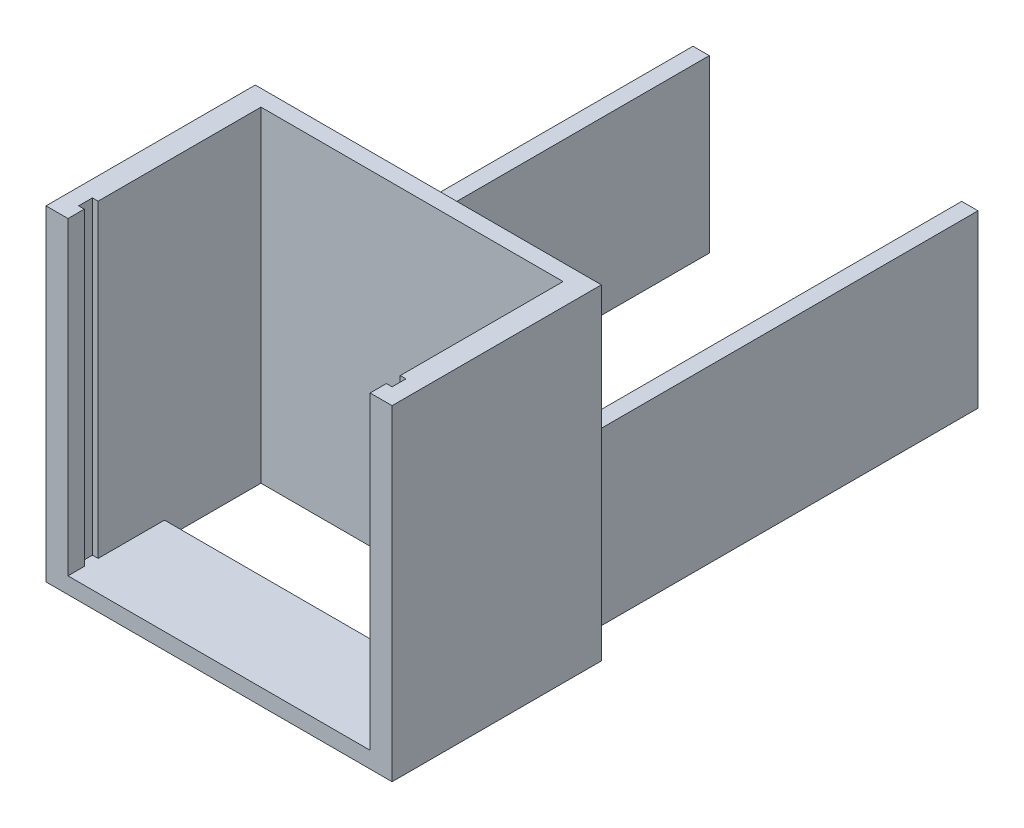
ISO-10303-21;
HEADER;
FILE_DESCRIPTION(('STEP AP214'),'2;1');
FILE_NAME('part.step','',(''),(''),'','','');
FILE_SCHEMA(('AUTOMOTIVE_DESIGN { 1 0 10303 214 1 1 1 1 }'));
ENDSEC;
DATA;
#1=APPLICATION_CONTEXT('core data for automotive mechanical design processes');
#2=APPLICATION_PROTOCOL_DEFINITION('international standard','automotive_design',2000,#1);
#3=PRODUCT_CONTEXT('',#1,'mechanical');
#4=PRODUCT('Part','Part','',(#3));
#5=PRODUCT_RELATED_PRODUCT_CATEGORY('part','',(#4));
#6=PRODUCT_DEFINITION_FORMATION('','',#4);
#7=PRODUCT_DEFINITION_CONTEXT('part definition',#1,'design');
#8=PRODUCT_DEFINITION('design','',#6,#7);
#9=PRODUCT_DEFINITION_SHAPE('','',#8);
#10=(LENGTH_UNIT() NAMED_UNIT(*) SI_UNIT(.MILLI.,.METRE.));
#11=(NAMED_UNIT(*) PLANE_ANGLE_UNIT() SI_UNIT($,.RADIAN.));
#12=(NAMED_UNIT(*) SI_UNIT($,.STERADIAN.) SOLID_ANGLE_UNIT());
#13=UNCERTAINTY_MEASURE_WITH_UNIT(LENGTH_MEASURE(1.E-05),#10,'distance_accuracy_value','');
#14=(GEOMETRIC_REPRESENTATION_CONTEXT(3) GLOBAL_UNCERTAINTY_ASSIGNED_CONTEXT((#13)) GLOBAL_UNIT_ASSIGNED_CONTEXT((#10,
#11,#12)) REPRESENTATION_CONTEXT('',''));
#15=CARTESIAN_POINT('',(0.,0.,0.));
#16=DIRECTION('',(0.,0.,1.));
#17=DIRECTION('',(1.,0.,0.));
#18=AXIS2_PLACEMENT_3D('',#15,#16,#17);
#19=CARTESIAN_POINT('',(0.,0.,2.39346473029046));
#20=DIRECTION('',(0.,0.,-1.));
#21=DIRECTION('',(-1.,0.,0.));
#22=AXIS2_PLACEMENT_3D('',#19,#20,#21);
#23=PLANE('',#22);
#24=DIRECTION('',(0.,-1.,0.));
#25=VECTOR('',#24,1.);
#26=CARTESIAN_POINT('',(-61.1489834024897,0.,2.39346473029046));
#27=LINE('',#26,#25);
#28=CARTESIAN_POINT('',(-61.1489834024897,19.,2.39346473029046));
#29=VERTEX_POINT('',#28);
#30=CARTESIAN_POINT('',(-61.1489834024897,-2.,2.39346473029046));
#31=VERTEX_POINT('',#30);
#32=EDGE_CURVE('E214',#29,#31,#27,.T.);
#33=ORIENTED_EDGE('',*,*,#32,.T.);
#34=DIRECTION('',(-1.,0.,0.));
#35=VECTOR('',#34,1.);
#36=CARTESIAN_POINT('',(-22.3989834024897,-2.,2.39346473029046));
#37=LINE('',#36,#35);
#38=CARTESIAN_POINT('',(-64.8989834024897,-2.,2.39346473029046));
#39=VERTEX_POINT('',#38);
#40=EDGE_CURVE('E294',#31,#39,#37,.T.);
#41=ORIENTED_EDGE('',*,*,#40,.T.);
#42=DIRECTION('',(0.,1.,0.));
#43=VECTOR('',#42,1.);
#44=CARTESIAN_POINT('',(-64.8989834024897,38.,2.39346473029046));
#45=LINE('',#44,#43);
#46=CARTESIAN_POINT('',(-64.8989834024897,38.,2.39346473029046));
#47=VERTEX_POINT('',#46);
#48=EDGE_CURVE('E298',#39,#47,#45,.T.);
#49=ORIENTED_EDGE('',*,*,#48,.T.);
#50=DIRECTION('',(1.,0.,0.));
#51=VECTOR('',#50,1.);
#52=CARTESIAN_POINT('',(-22.3989834024897,38.,2.39346473029046));
#53=LINE('',#52,#51);
#54=CARTESIAN_POINT('',(-22.3989834024897,38.,2.39346473029046));
#55=VERTEX_POINT('',#54);
#56=EDGE_CURVE('E302',#47,#55,#53,.T.);
#57=ORIENTED_EDGE('',*,*,#56,.T.);
#58=DIRECTION('',(0.,-1.,0.));
#59=VECTOR('',#58,1.);
#60=CARTESIAN_POINT('',(-22.3989834024897,38.,2.39346473029046));
#61=LINE('',#60,#59);
#62=CARTESIAN_POINT('',(-22.3989834024897,-2.,2.39346473029046));
#63=VERTEX_POINT('',#62);
#64=EDGE_CURVE('E291',#55,#63,#61,.T.);
#65=ORIENTED_EDGE('',*,*,#64,.T.);
#66=CARTESIAN_POINT('',(-26.1489834024897,-2.,2.39346473029046));
#67=VERTEX_POINT('',#66);
#68=EDGE_CURVE('E295',#63,#67,#37,.T.);
#69=ORIENTED_EDGE('',*,*,#68,.T.);
#70=DIRECTION('',(0.,-1.,0.));
#71=VECTOR('',#70,1.);
#72=CARTESIAN_POINT('',(-26.1489834024897,0.,2.39346473029046));
#73=LINE('',#72,#71);
#74=CARTESIAN_POINT('',(-26.1489834024897,19.,2.39346473029046));
#75=VERTEX_POINT('',#74);
#76=EDGE_CURVE('E248',#75,#67,#73,.T.);
#77=ORIENTED_EDGE('',*,*,#76,.F.);
#78=DIRECTION('',(-1.,0.,0.));
#79=VECTOR('',#78,1.);
#80=CARTESIAN_POINT('',(0.,19.,2.39346473029046));
#81=LINE('',#80,#79);
#82=CARTESIAN_POINT('',(-28.1489834024897,19.,2.39346473029046));
#83=VERTEX_POINT('',#82);
#84=EDGE_CURVE('E258',#75,#83,#81,.T.);
#85=ORIENTED_EDGE('',*,*,#84,.T.);
#86=DIRECTION('',(0.,-1.,0.));
#87=VECTOR('',#86,1.);
#88=CARTESIAN_POINT('',(-28.1489834024897,0.,2.39346473029046));
#89=LINE('',#88,#87);
#90=CARTESIAN_POINT('',(-28.1489834024897,-2.,2.39346473029046));
#91=VERTEX_POINT('',#90);
#92=EDGE_CURVE('E217',#83,#91,#89,.T.);
#93=ORIENTED_EDGE('',*,*,#92,.T.);
#94=CARTESIAN_POINT('',(-59.1489834024897,-2.,2.39346473029046));
#95=VERTEX_POINT('',#94);
#96=EDGE_CURVE('E299',#91,#95,#37,.T.);
#97=ORIENTED_EDGE('',*,*,#96,.T.);
#98=DIRECTION('',(0.,-1.,0.));
#99=VECTOR('',#98,1.);
#100=CARTESIAN_POINT('',(-59.1489834024897,0.,2.39346473029046));
#101=LINE('',#100,#99);
#102=CARTESIAN_POINT('',(-59.1489834024897,19.,2.39346473029046));
#103=VERTEX_POINT('',#102);
#104=EDGE_CURVE('E57',#103,#95,#101,.T.);
#105=ORIENTED_EDGE('',*,*,#104,.F.);
#106=DIRECTION('',(-1.,0.,0.));
#107=VECTOR('',#106,1.);
#108=CARTESIAN_POINT('',(0.,18.9999999999999,2.39346473029046));
#109=LINE('',#108,#107);
#110=EDGE_CURVE('E52',#103,#29,#109,.T.);
#111=ORIENTED_EDGE('',*,*,#110,.T.);
#112=EDGE_LOOP('',(#33,#41,#49,#57,#65,#69,#77,#85,#93,#97,#105,#111));
#113=FACE_BOUND('',#112,.T.);
#114=ADVANCED_FACE('F37',(#113),#23,.T.);
#115=CARTESIAN_POINT('',(0.,0.,0.));
#116=DIRECTION('',(0.,-1.,0.));
#117=DIRECTION('',(0.,0.,-1.));
#118=AXIS2_PLACEMENT_3D('',#115,#116,#117);
#119=PLANE('',#118);
#120=DIRECTION('',(0.,0.,1.));
#121=VECTOR('',#120,1.);
#122=CARTESIAN_POINT('',(-25.0989834024897,0.,0.));
#123=LINE('',#122,#121);
#124=CARTESIAN_POINT('',(-25.0989834024897,0.,16.2434647302905));
#125=VERTEX_POINT('',#124);
#126=CARTESIAN_POINT('',(-25.0989834024897,0.,24.3934647302905));
#127=VERTEX_POINT('',#126);
#128=EDGE_CURVE('E312',#125,#127,#123,.T.);
#129=ORIENTED_EDGE('',*,*,#128,.F.);
#130=DIRECTION('',(1.,0.,0.));
#131=VECTOR('',#130,1.);
#132=CARTESIAN_POINT('',(0.,0.,16.2434647302905));
#133=LINE('',#132,#131);
#134=CARTESIAN_POINT('',(-62.1989834024897,0.,16.2434647302905));
#135=VERTEX_POINT('',#134);
#136=EDGE_CURVE('E271',#135,#125,#133,.T.);
#137=ORIENTED_EDGE('',*,*,#136,.F.);
#138=DIRECTION('',(0.,0.,1.));
#139=VECTOR('',#138,1.);
#140=CARTESIAN_POINT('',(-62.1989834024897,0.,0.));
#141=LINE('',#140,#139);
#142=CARTESIAN_POINT('',(-62.1989834024897,0.,24.3934647302905));
#143=VERTEX_POINT('',#142);
#144=EDGE_CURVE('E371',#135,#143,#141,.T.);
#145=ORIENTED_EDGE('',*,*,#144,.T.);
#146=DIRECTION('',(1.,0.,0.));
#147=VECTOR('',#146,1.);
#148=CARTESIAN_POINT('',(0.,0.,24.3934647302905));
#149=LINE('',#148,#147);
#150=CARTESIAN_POINT('',(-62.8989834024897,0.,24.3934647302905));
#151=VERTEX_POINT('',#150);
#152=EDGE_CURVE('E393',#151,#143,#149,.T.);
#153=ORIENTED_EDGE('',*,*,#152,.F.);
#154=DIRECTION('',(0.,0.,1.));
#155=VECTOR('',#154,1.);
#156=CARTESIAN_POINT('',(-62.8989834024897,0.,0.));
#157=LINE('',#156,#155);
#158=CARTESIAN_POINT('',(-62.8989834024897,0.,26.0934647302905));
#159=VERTEX_POINT('',#158);
#160=EDGE_CURVE('E390',#151,#159,#157,.T.);
#161=ORIENTED_EDGE('',*,*,#160,.T.);
#162=DIRECTION('',(1.,0.,0.));
#163=VECTOR('',#162,1.);
#164=CARTESIAN_POINT('',(0.,0.,26.0934647302905));
#165=LINE('',#164,#163);
#166=CARTESIAN_POINT('',(-62.1989834024897,0.,26.0934647302905));
#167=VERTEX_POINT('',#166);
#168=EDGE_CURVE('E387',#159,#167,#165,.T.);
#169=ORIENTED_EDGE('',*,*,#168,.T.);
#170=CARTESIAN_POINT('',(-62.1989834024897,0.,28.0934647302905));
#171=VERTEX_POINT('',#170);
#172=EDGE_CURVE('E366',#167,#171,#141,.T.);
#173=ORIENTED_EDGE('',*,*,#172,.T.);
#174=DIRECTION('',(1.,0.,0.));
#175=VECTOR('',#174,1.);
#176=CARTESIAN_POINT('',(-64.8989834024897,0.,28.0934647302905));
#177=LINE('',#176,#175);
#178=CARTESIAN_POINT('',(-25.0989834024897,0.,28.0934647302905));
#179=VERTEX_POINT('',#178);
#180=EDGE_CURVE('E354',#171,#179,#177,.T.);
#181=ORIENTED_EDGE('',*,*,#180,.T.);
#182=CARTESIAN_POINT('',(-25.0989834024897,0.,26.0934647302905));
#183=VERTEX_POINT('',#182);
#184=EDGE_CURVE('E317',#183,#179,#123,.T.);
#185=ORIENTED_EDGE('',*,*,#184,.F.);
#186=DIRECTION('',(1.,0.,0.));
#187=VECTOR('',#186,1.);
#188=CARTESIAN_POINT('',(0.,0.,26.0934647302905));
#189=LINE('',#188,#187);
#190=CARTESIAN_POINT('',(-24.3989834024897,0.,26.0934647302905));
#191=VERTEX_POINT('',#190);
#192=EDGE_CURVE('E338',#183,#191,#189,.T.);
#193=ORIENTED_EDGE('',*,*,#192,.T.);
#194=DIRECTION('',(0.,0.,1.));
#195=VECTOR('',#194,1.);
#196=CARTESIAN_POINT('',(-24.3989834024897,0.,0.));
#197=LINE('',#196,#195);
#198=CARTESIAN_POINT('',(-24.3989834024897,0.,24.3934647302905));
#199=VERTEX_POINT('',#198);
#200=EDGE_CURVE('E335',#199,#191,#197,.T.);
#201=ORIENTED_EDGE('',*,*,#200,.F.);
#202=DIRECTION('',(1.,0.,0.));
#203=VECTOR('',#202,1.);
#204=CARTESIAN_POINT('',(0.,0.,24.3934647302905));
#205=LINE('',#204,#203);
#206=EDGE_CURVE('E332',#127,#199,#205,.T.);
#207=ORIENTED_EDGE('',*,*,#206,.F.);
#208=EDGE_LOOP('',(#129,#137,#145,#153,#161,#169,#173,#181,#185,#193,#201,#207));
#209=FACE_BOUND('',#208,.T.);
#210=ADVANCED_FACE('F413',(#209),#119,.F.);
#211=CARTESIAN_POINT('',(-64.8989834024897,38.,0.));
#212=DIRECTION('',(1.,0.,0.));
#213=DIRECTION('',(0.,0.,-1.));
#214=AXIS2_PLACEMENT_3D('',#211,#212,#213);
#215=PLANE('',#214);
#216=DIRECTION('',(0.,0.,1.));
#217=VECTOR('',#216,1.);
#218=CARTESIAN_POINT('',(-64.8989834024897,38.,0.));
#219=LINE('',#218,#217);
#220=CARTESIAN_POINT('',(-64.8989834024897,38.,28.0934647302905));
#221=VERTEX_POINT('',#220);
#222=EDGE_CURVE('E367',#47,#221,#219,.T.);
#223=ORIENTED_EDGE('',*,*,#222,.F.);
#224=ORIENTED_EDGE('',*,*,#48,.F.);
#225=DIRECTION('',(0.,0.,1.));
#226=VECTOR('',#225,1.);
#227=CARTESIAN_POINT('',(-64.8989834024897,-2.,28.0934647302905));
#228=LINE('',#227,#226);
#229=CARTESIAN_POINT('',(-64.8989834024897,-2.,28.0934647302905));
#230=VERTEX_POINT('',#229);
#231=EDGE_CURVE('E355',#39,#230,#228,.T.);
#232=ORIENTED_EDGE('',*,*,#231,.T.);
#233=DIRECTION('',(0.,-1.,0.));
#234=VECTOR('',#233,1.);
#235=CARTESIAN_POINT('',(-64.8989834024897,38.,28.0934647302905));
#236=LINE('',#235,#234);
#237=EDGE_CURVE('E11',#221,#230,#236,.T.);
#238=ORIENTED_EDGE('',*,*,#237,.F.);
#239=EDGE_LOOP('',(#223,#224,#232,#238));
#240=FACE_BOUND('',#239,.T.);
#241=ADVANCED_FACE('F39',(#240),#215,.F.);
#242=CARTESIAN_POINT('',(0.,38.,28.0934647302905));
#243=DIRECTION('',(0.,0.,-1.));
#244=DIRECTION('',(-1.,0.,0.));
#245=AXIS2_PLACEMENT_3D('',#242,#243,#244);
#246=PLANE('',#245);
#247=ORIENTED_EDGE('',*,*,#237,.T.);
#248=DIRECTION('',(1.,0.,0.));
#249=VECTOR('',#248,1.);
#250=CARTESIAN_POINT('',(-64.8989834024897,-2.,28.0934647302905));
#251=LINE('',#250,#249);
#252=CARTESIAN_POINT('',(-22.3989834024897,-2.,28.0934647302905));
#253=VERTEX_POINT('',#252);
#254=EDGE_CURVE('E358',#230,#253,#251,.T.);
#255=ORIENTED_EDGE('',*,*,#254,.T.);
#256=DIRECTION('',(0.,1.,0.));
#257=VECTOR('',#256,1.);
#258=CARTESIAN_POINT('',(-22.3989834024897,-2.,28.0934647302905));
#259=LINE('',#258,#257);
#260=CARTESIAN_POINT('',(-22.3989834024897,38.,28.0934647302905));
#261=VERTEX_POINT('',#260);
#262=EDGE_CURVE('E363',#253,#261,#259,.T.);
#263=ORIENTED_EDGE('',*,*,#262,.T.);
#264=DIRECTION('',(1.,0.,0.));
#265=VECTOR('',#264,1.);
#266=CARTESIAN_POINT('',(0.,38.,28.0934647302905));
#267=LINE('',#266,#265);
#268=CARTESIAN_POINT('',(-25.0989834024897,38.,28.0934647302905));
#269=VERTEX_POINT('',#268);
#270=EDGE_CURVE('E327',#269,#261,#267,.T.);
#271=ORIENTED_EDGE('',*,*,#270,.F.);
#272=DIRECTION('',(0.,-1.,0.));
#273=VECTOR('',#272,1.);
#274=CARTESIAN_POINT('',(-25.0989834024897,38.,28.0934647302905));
#275=LINE('',#274,#273);
#276=EDGE_CURVE('E330',#269,#179,#275,.T.);
#277=ORIENTED_EDGE('',*,*,#276,.T.);
#278=ORIENTED_EDGE('',*,*,#180,.F.);
#279=DIRECTION('',(0.,-1.,0.));
#280=VECTOR('',#279,1.);
#281=CARTESIAN_POINT('',(-62.1989834024897,38.,28.0934647302905));
#282=LINE('',#281,#280);
#283=CARTESIAN_POINT('',(-62.1989834024897,38.,28.0934647302905));
#284=VERTEX_POINT('',#283);
#285=EDGE_CURVE('E45',#284,#171,#282,.T.);
#286=ORIENTED_EDGE('',*,*,#285,.F.);
#287=DIRECTION('',(1.,0.,0.));
#288=VECTOR('',#287,1.);
#289=CARTESIAN_POINT('',(0.,38.,28.0934647302905));
#290=LINE('',#289,#288);
#291=EDGE_CURVE('E370',#221,#284,#290,.T.);
#292=ORIENTED_EDGE('',*,*,#291,.F.);
#293=EDGE_LOOP('',(#247,#255,#263,#271,#277,#278,#286,#292));
#294=FACE_BOUND('',#293,.T.);
#295=ADVANCED_FACE('F416',(#294),#246,.F.);
#296=CARTESIAN_POINT('',(-62.1989834024897,38.,0.));
#297=DIRECTION('',(1.,0.,0.));
#298=DIRECTION('',(0.,0.,-1.));
#299=AXIS2_PLACEMENT_3D('',#296,#297,#298);
#300=PLANE('',#299);
#301=ORIENTED_EDGE('',*,*,#172,.F.);
#302=DIRECTION('',(0.,-1.,0.));
#303=VECTOR('',#302,1.);
#304=CARTESIAN_POINT('',(-62.1989834024897,38.,26.0934647302905));
#305=LINE('',#304,#303);
#306=CARTESIAN_POINT('',(-62.1989834024897,38.,26.0934647302905));
#307=VERTEX_POINT('',#306);
#308=EDGE_CURVE('E403',#307,#167,#305,.T.);
#309=ORIENTED_EDGE('',*,*,#308,.F.);
#310=DIRECTION('',(0.,0.,1.));
#311=VECTOR('',#310,1.);
#312=CARTESIAN_POINT('',(-62.1989834024897,38.,0.));
#313=LINE('',#312,#311);
#314=EDGE_CURVE('E373',#307,#284,#313,.T.);
#315=ORIENTED_EDGE('',*,*,#314,.T.);
#316=ORIENTED_EDGE('',*,*,#285,.T.);
#317=EDGE_LOOP('',(#301,#309,#315,#316));
#318=FACE_BOUND('',#317,.T.);
#319=ADVANCED_FACE('F407',(#318),#300,.T.);
#320=CARTESIAN_POINT('',(0.,38.,26.0934647302905));
#321=DIRECTION('',(0.,0.,-1.));
#322=DIRECTION('',(-1.,0.,0.));
#323=AXIS2_PLACEMENT_3D('',#320,#321,#322);
#324=PLANE('',#323);
#325=ORIENTED_EDGE('',*,*,#168,.F.);
#326=DIRECTION('',(0.,-1.,0.));
#327=VECTOR('',#326,1.);
#328=CARTESIAN_POINT('',(-62.8989834024897,38.,26.0934647302905));
#329=LINE('',#328,#327);
#330=CARTESIAN_POINT('',(-62.8989834024897,38.,26.0934647302905));
#331=VERTEX_POINT('',#330);
#332=EDGE_CURVE('E401',#331,#159,#329,.T.);
#333=ORIENTED_EDGE('',*,*,#332,.F.);
#334=DIRECTION('',(1.,0.,0.));
#335=VECTOR('',#334,1.);
#336=CARTESIAN_POINT('',(0.,38.,26.0934647302905));
#337=LINE('',#336,#335);
#338=EDGE_CURVE('E376',#331,#307,#337,.T.);
#339=ORIENTED_EDGE('',*,*,#338,.T.);
#340=ORIENTED_EDGE('',*,*,#308,.T.);
#341=EDGE_LOOP('',(#325,#333,#339,#340));
#342=FACE_BOUND('',#341,.T.);
#343=ADVANCED_FACE('F460',(#342),#324,.T.);
#344=CARTESIAN_POINT('',(-62.8989834024897,38.,0.));
#345=DIRECTION('',(1.,0.,0.));
#346=DIRECTION('',(0.,0.,-1.));
#347=AXIS2_PLACEMENT_3D('',#344,#345,#346);
#348=PLANE('',#347);
#349=ORIENTED_EDGE('',*,*,#160,.F.);
#350=DIRECTION('',(0.,-1.,0.));
#351=VECTOR('',#350,1.);
#352=CARTESIAN_POINT('',(-62.8989834024897,38.,24.3934647302905));
#353=LINE('',#352,#351);
#354=CARTESIAN_POINT('',(-62.8989834024897,38.,24.3934647302905));
#355=VERTEX_POINT('',#354);
#356=EDGE_CURVE('E399',#355,#151,#353,.T.);
#357=ORIENTED_EDGE('',*,*,#356,.F.);
#358=DIRECTION('',(0.,0.,1.));
#359=VECTOR('',#358,1.);
#360=CARTESIAN_POINT('',(-62.8989834024897,38.,0.));
#361=LINE('',#360,#359);
#362=EDGE_CURVE('E380',#355,#331,#361,.T.);
#363=ORIENTED_EDGE('',*,*,#362,.T.);
#364=ORIENTED_EDGE('',*,*,#332,.T.);
#365=EDGE_LOOP('',(#349,#357,#363,#364));
#366=FACE_BOUND('',#365,.T.);
#367=ADVANCED_FACE('F457',(#366),#348,.T.);
#368=CARTESIAN_POINT('',(0.,38.,24.3934647302905));
#369=DIRECTION('',(0.,0.,-1.));
#370=DIRECTION('',(-1.,0.,0.));
#371=AXIS2_PLACEMENT_3D('',#368,#369,#370);
#372=PLANE('',#371);
#373=ORIENTED_EDGE('',*,*,#152,.T.);
#374=DIRECTION('',(0.,-1.,0.));
#375=VECTOR('',#374,1.);
#376=CARTESIAN_POINT('',(-62.1989834024897,38.,24.3934647302905));
#377=LINE('',#376,#375);
#378=CARTESIAN_POINT('',(-62.1989834024897,38.,24.3934647302905));
#379=VERTEX_POINT('',#378);
#380=EDGE_CURVE('E396',#379,#143,#377,.T.);
#381=ORIENTED_EDGE('',*,*,#380,.F.);
#382=DIRECTION('',(1.,0.,0.));
#383=VECTOR('',#382,1.);
#384=CARTESIAN_POINT('',(0.,38.,24.3934647302905));
#385=LINE('',#384,#383);
#386=EDGE_CURVE('E383',#355,#379,#385,.T.);
#387=ORIENTED_EDGE('',*,*,#386,.F.);
#388=ORIENTED_EDGE('',*,*,#356,.T.);
#389=EDGE_LOOP('',(#373,#381,#387,#388));
#390=FACE_BOUND('',#389,.T.);
#391=ADVANCED_FACE('F453',(#390),#372,.F.);
#392=ORIENTED_EDGE('',*,*,#144,.F.);
#393=DIRECTION('',(0.,1.,0.));
#394=VECTOR('',#393,1.);
#395=CARTESIAN_POINT('',(-62.1989834024897,-2.,16.2434647302905));
#396=LINE('',#395,#394);
#397=CARTESIAN_POINT('',(-62.1989834024897,-2.,16.2434647302905));
#398=VERTEX_POINT('',#397);
#399=EDGE_CURVE('E284',#398,#135,#396,.T.);
#400=ORIENTED_EDGE('',*,*,#399,.F.);
#401=DIRECTION('',(0.,0.,1.));
#402=VECTOR('',#401,1.);
#403=CARTESIAN_POINT('',(-62.1989834024897,-2.,0.));
#404=LINE('',#403,#402);
#405=CARTESIAN_POINT('',(-62.1989834024897,-2.,4.39346473029046));
#406=VERTEX_POINT('',#405);
#407=EDGE_CURVE('E272',#406,#398,#404,.T.);
#408=ORIENTED_EDGE('',*,*,#407,.F.);
#409=DIRECTION('',(0.,-1.,0.));
#410=VECTOR('',#409,1.);
#411=CARTESIAN_POINT('',(-62.1989834024897,0.,4.39346473029046));
#412=LINE('',#411,#410);
#413=CARTESIAN_POINT('',(-62.1989834024897,38.,4.39346473029046));
#414=VERTEX_POINT('',#413);
#415=EDGE_CURVE('E305',#414,#406,#412,.T.);
#416=ORIENTED_EDGE('',*,*,#415,.F.);
#417=EDGE_CURVE('E377',#414,#379,#313,.T.);
#418=ORIENTED_EDGE('',*,*,#417,.T.);
#419=ORIENTED_EDGE('',*,*,#380,.T.);
#420=EDGE_LOOP('',(#392,#400,#408,#416,#418,#419));
#421=FACE_BOUND('',#420,.T.);
#422=ADVANCED_FACE('F446',(#421),#300,.T.);
#423=CARTESIAN_POINT('',(0.,38.,0.));
#424=DIRECTION('',(0.,1.,0.));
#425=DIRECTION('',(0.,0.,1.));
#426=AXIS2_PLACEMENT_3D('',#423,#424,#425);
#427=PLANE('',#426);
#428=ORIENTED_EDGE('',*,*,#222,.T.);
#429=ORIENTED_EDGE('',*,*,#291,.T.);
#430=ORIENTED_EDGE('',*,*,#314,.F.);
#431=ORIENTED_EDGE('',*,*,#338,.F.);
#432=ORIENTED_EDGE('',*,*,#362,.F.);
#433=ORIENTED_EDGE('',*,*,#386,.T.);
#434=ORIENTED_EDGE('',*,*,#417,.F.);
#435=DIRECTION('',(1.,0.,0.));
#436=VECTOR('',#435,1.);
#437=CARTESIAN_POINT('',(-22.3989834024897,38.,4.39346473029046));
#438=LINE('',#437,#436);
#439=CARTESIAN_POINT('',(-25.0989834024897,38.,4.39346473029046));
#440=VERTEX_POINT('',#439);
#441=EDGE_CURVE('E289',#414,#440,#438,.T.);
#442=ORIENTED_EDGE('',*,*,#441,.T.);
#443=DIRECTION('',(0.,0.,1.));
#444=VECTOR('',#443,1.);
#445=CARTESIAN_POINT('',(-25.0989834024897,38.,0.));
#446=LINE('',#445,#444);
#447=CARTESIAN_POINT('',(-25.0989834024897,38.,24.3934647302905));
#448=VERTEX_POINT('',#447);
#449=EDGE_CURVE('E316',#440,#448,#446,.T.);
#450=ORIENTED_EDGE('',*,*,#449,.T.);
#451=DIRECTION('',(1.,0.,0.));
#452=VECTOR('',#451,1.);
#453=CARTESIAN_POINT('',(0.,38.,24.3934647302905));
#454=LINE('',#453,#452);
#455=CARTESIAN_POINT('',(-24.3989834024897,38.,24.3934647302905));
#456=VERTEX_POINT('',#455);
#457=EDGE_CURVE('E319',#448,#456,#454,.T.);
#458=ORIENTED_EDGE('',*,*,#457,.T.);
#459=DIRECTION('',(0.,0.,1.));
#460=VECTOR('',#459,1.);
#461=CARTESIAN_POINT('',(-24.3989834024897,38.,0.));
#462=LINE('',#461,#460);
#463=CARTESIAN_POINT('',(-24.3989834024897,38.,26.0934647302905));
#464=VERTEX_POINT('',#463);
#465=EDGE_CURVE('E322',#456,#464,#462,.T.);
#466=ORIENTED_EDGE('',*,*,#465,.T.);
#467=DIRECTION('',(1.,0.,0.));
#468=VECTOR('',#467,1.);
#469=CARTESIAN_POINT('',(0.,38.,26.0934647302905));
#470=LINE('',#469,#468);
#471=CARTESIAN_POINT('',(-25.0989834024897,38.,26.0934647302905));
#472=VERTEX_POINT('',#471);
#473=EDGE_CURVE('E324',#472,#464,#470,.T.);
#474=ORIENTED_EDGE('',*,*,#473,.F.);
#475=EDGE_CURVE('E320',#472,#269,#446,.T.);
#476=ORIENTED_EDGE('',*,*,#475,.T.);
#477=ORIENTED_EDGE('',*,*,#270,.T.);
#478=DIRECTION('',(0.,0.,1.));
#479=VECTOR('',#478,1.);
#480=CARTESIAN_POINT('',(-22.3989834024897,38.,0.));
#481=LINE('',#480,#479);
#482=EDGE_CURVE('E313',#55,#261,#481,.T.);
#483=ORIENTED_EDGE('',*,*,#482,.F.);
#484=ORIENTED_EDGE('',*,*,#56,.F.);
#485=EDGE_LOOP('',(#428,#429,#430,#431,#432,#433,#434,#442,#450,#458,#466,#474,#476,#477,#483,#484));
#486=FACE_BOUND('',#485,.T.);
#487=ADVANCED_FACE('F462',(#486),#427,.T.);
#488=CARTESIAN_POINT('',(-22.3989834024897,-2.,28.0934647302905));
#489=DIRECTION('',(1.,0.,0.));
#490=DIRECTION('',(0.,0.,-1.));
#491=AXIS2_PLACEMENT_3D('',#488,#489,#490);
#492=PLANE('',#491);
#493=DIRECTION('',(0.,0.,-1.));
#494=VECTOR('',#493,1.);
#495=CARTESIAN_POINT('',(-22.3989834024897,-2.,28.0934647302905));
#496=LINE('',#495,#494);
#497=EDGE_CURVE('E361',#253,#63,#496,.T.);
#498=ORIENTED_EDGE('',*,*,#497,.T.);
#499=ORIENTED_EDGE('',*,*,#64,.F.);
#500=ORIENTED_EDGE('',*,*,#482,.T.);
#501=ORIENTED_EDGE('',*,*,#262,.F.);
#502=EDGE_LOOP('',(#498,#499,#500,#501));
#503=FACE_BOUND('',#502,.T.);
#504=ADVANCED_FACE('F475',(#503),#492,.T.);
#505=CARTESIAN_POINT('',(0.,-2.,0.));
#506=DIRECTION('',(0.,-1.,0.));
#507=DIRECTION('',(0.,0.,-1.));
#508=AXIS2_PLACEMENT_3D('',#505,#506,#507);
#509=PLANE('',#508);
#510=ORIENTED_EDGE('',*,*,#407,.T.);
#511=DIRECTION('',(1.,0.,0.));
#512=VECTOR('',#511,1.);
#513=CARTESIAN_POINT('',(0.,-2.,16.2434647302905));
#514=LINE('',#513,#512);
#515=CARTESIAN_POINT('',(-25.0989834024897,-2.,16.2434647302905));
#516=VERTEX_POINT('',#515);
#517=EDGE_CURVE('E275',#398,#516,#514,.T.);
#518=ORIENTED_EDGE('',*,*,#517,.T.);
#519=DIRECTION('',(0.,0.,-1.));
#520=VECTOR('',#519,1.);
#521=CARTESIAN_POINT('',(-25.0989834024897,-2.,0.));
#522=LINE('',#521,#520);
#523=CARTESIAN_POINT('',(-25.0989834024897,-2.,4.39346473029046));
#524=VERTEX_POINT('',#523);
#525=EDGE_CURVE('E278',#516,#524,#522,.T.);
#526=ORIENTED_EDGE('',*,*,#525,.T.);
#527=DIRECTION('',(-1.,0.,0.));
#528=VECTOR('',#527,1.);
#529=CARTESIAN_POINT('',(0.,-2.,4.39346473029046));
#530=LINE('',#529,#528);
#531=EDGE_CURVE('E281',#524,#406,#530,.T.);
#532=ORIENTED_EDGE('',*,*,#531,.T.);
#533=EDGE_LOOP('',(#510,#518,#526,#532));
#534=FACE_BOUND('',#533,.T.);
#535=ORIENTED_EDGE('',*,*,#231,.F.);
#536=ORIENTED_EDGE('',*,*,#40,.F.);
#537=DIRECTION('',(0.,0.,1.));
#538=VECTOR('',#537,1.);
#539=CARTESIAN_POINT('',(-61.1489834024897,-2.,-47.6065352697095));
#540=LINE('',#539,#538);
#541=CARTESIAN_POINT('',(-61.1489834024897,-2.,-47.6065352697095));
#542=VERTEX_POINT('',#541);
#543=EDGE_CURVE('E235',#542,#31,#540,.T.);
#544=ORIENTED_EDGE('',*,*,#543,.F.);
#545=DIRECTION('',(-1.,0.,0.));
#546=VECTOR('',#545,1.);
#547=CARTESIAN_POINT('',(0.,-2.,-47.6065352697095));
#548=LINE('',#547,#546);
#549=CARTESIAN_POINT('',(-59.1489834024897,-2.,-47.6065352697095));
#550=VERTEX_POINT('',#549);
#551=EDGE_CURVE('E225',#550,#542,#548,.T.);
#552=ORIENTED_EDGE('',*,*,#551,.F.);
#553=DIRECTION('',(0.,0.,1.));
#554=VECTOR('',#553,1.);
#555=CARTESIAN_POINT('',(-59.1489834024897,-2.,-47.6065352697095));
#556=LINE('',#555,#554);
#557=EDGE_CURVE('E240',#550,#95,#556,.T.);
#558=ORIENTED_EDGE('',*,*,#557,.T.);
#559=ORIENTED_EDGE('',*,*,#96,.F.);
#560=DIRECTION('',(0.,0.,1.));
#561=VECTOR('',#560,1.);
#562=CARTESIAN_POINT('',(-28.1489834024897,-2.,-47.6065352697095));
#563=LINE('',#562,#561);
#564=CARTESIAN_POINT('',(-28.1489834024897,-2.,-47.6065352697095));
#565=VERTEX_POINT('',#564);
#566=EDGE_CURVE('E255',#565,#91,#563,.T.);
#567=ORIENTED_EDGE('',*,*,#566,.F.);
#568=DIRECTION('',(-1.,0.,0.));
#569=VECTOR('',#568,1.);
#570=CARTESIAN_POINT('',(0.,-2.,-47.6065352697095));
#571=LINE('',#570,#569);
#572=CARTESIAN_POINT('',(-26.1489834024897,-2.,-47.6065352697095));
#573=VERTEX_POINT('',#572);
#574=EDGE_CURVE('E253',#573,#565,#571,.T.);
#575=ORIENTED_EDGE('',*,*,#574,.F.);
#576=DIRECTION('',(0.,0.,1.));
#577=VECTOR('',#576,1.);
#578=CARTESIAN_POINT('',(-26.1489834024897,-2.,-47.6065352697095));
#579=LINE('',#578,#577);
#580=EDGE_CURVE('E263',#573,#67,#579,.T.);
#581=ORIENTED_EDGE('',*,*,#580,.T.);
#582=ORIENTED_EDGE('',*,*,#68,.F.);
#583=ORIENTED_EDGE('',*,*,#497,.F.);
#584=ORIENTED_EDGE('',*,*,#254,.F.);
#585=EDGE_LOOP('',(#535,#536,#544,#552,#558,#559,#567,#575,#581,#582,#583,#584));
#586=FACE_BOUND('',#585,.T.);
#587=ADVANCED_FACE('F470',(#534,#586),#509,.T.);
#588=CARTESIAN_POINT('',(-25.0989834024897,38.,0.));
#589=DIRECTION('',(1.,0.,0.));
#590=DIRECTION('',(0.,0.,-1.));
#591=AXIS2_PLACEMENT_3D('',#588,#589,#590);
#592=PLANE('',#591);
#593=DIRECTION('',(0.,1.,0.));
#594=VECTOR('',#593,1.);
#595=CARTESIAN_POINT('',(-25.0989834024897,0.,4.39346473029046));
#596=LINE('',#595,#594);
#597=EDGE_CURVE('E309',#524,#440,#596,.T.);
#598=ORIENTED_EDGE('',*,*,#597,.F.);
#599=ORIENTED_EDGE('',*,*,#525,.F.);
#600=DIRECTION('',(0.,1.,0.));
#601=VECTOR('',#600,1.);
#602=CARTESIAN_POINT('',(-25.0989834024897,-2.,16.2434647302905));
#603=LINE('',#602,#601);
#604=EDGE_CURVE('E287',#516,#125,#603,.T.);
#605=ORIENTED_EDGE('',*,*,#604,.T.);
#606=ORIENTED_EDGE('',*,*,#128,.T.);
#607=DIRECTION('',(0.,-1.,0.));
#608=VECTOR('',#607,1.);
#609=CARTESIAN_POINT('',(-25.0989834024897,38.,24.3934647302905));
#610=LINE('',#609,#608);
#611=EDGE_CURVE('E351',#448,#127,#610,.T.);
#612=ORIENTED_EDGE('',*,*,#611,.F.);
#613=ORIENTED_EDGE('',*,*,#449,.F.);
#614=EDGE_LOOP('',(#598,#599,#605,#606,#612,#613));
#615=FACE_BOUND('',#614,.T.);
#616=ADVANCED_FACE('F439',(#615),#592,.F.);
#617=CARTESIAN_POINT('',(0.,38.,24.3934647302905));
#618=DIRECTION('',(0.,0.,-1.));
#619=DIRECTION('',(-1.,0.,0.));
#620=AXIS2_PLACEMENT_3D('',#617,#618,#619);
#621=PLANE('',#620);
#622=ORIENTED_EDGE('',*,*,#206,.T.);
#623=DIRECTION('',(0.,-1.,0.));
#624=VECTOR('',#623,1.);
#625=CARTESIAN_POINT('',(-24.3989834024897,38.,24.3934647302905));
#626=LINE('',#625,#624);
#627=EDGE_CURVE('E348',#456,#199,#626,.T.);
#628=ORIENTED_EDGE('',*,*,#627,.F.);
#629=ORIENTED_EDGE('',*,*,#457,.F.);
#630=ORIENTED_EDGE('',*,*,#611,.T.);
#631=EDGE_LOOP('',(#622,#628,#629,#630));
#632=FACE_BOUND('',#631,.T.);
#633=ADVANCED_FACE('F434',(#632),#621,.F.);
#634=CARTESIAN_POINT('',(-24.3989834024897,38.,0.));
#635=DIRECTION('',(1.,0.,0.));
#636=DIRECTION('',(0.,0.,-1.));
#637=AXIS2_PLACEMENT_3D('',#634,#635,#636);
#638=PLANE('',#637);
#639=ORIENTED_EDGE('',*,*,#200,.T.);
#640=DIRECTION('',(0.,-1.,0.));
#641=VECTOR('',#640,1.);
#642=CARTESIAN_POINT('',(-24.3989834024897,38.,26.0934647302905));
#643=LINE('',#642,#641);
#644=EDGE_CURVE('E345',#464,#191,#643,.T.);
#645=ORIENTED_EDGE('',*,*,#644,.F.);
#646=ORIENTED_EDGE('',*,*,#465,.F.);
#647=ORIENTED_EDGE('',*,*,#627,.T.);
#648=EDGE_LOOP('',(#639,#645,#646,#647));
#649=FACE_BOUND('',#648,.T.);
#650=ADVANCED_FACE('F430',(#649),#638,.F.);
#651=CARTESIAN_POINT('',(0.,38.,26.0934647302905));
#652=DIRECTION('',(0.,0.,-1.));
#653=DIRECTION('',(-1.,0.,0.));
#654=AXIS2_PLACEMENT_3D('',#651,#652,#653);
#655=PLANE('',#654);
#656=ORIENTED_EDGE('',*,*,#192,.F.);
#657=DIRECTION('',(0.,-1.,0.));
#658=VECTOR('',#657,1.);
#659=CARTESIAN_POINT('',(-25.0989834024897,38.,26.0934647302905));
#660=LINE('',#659,#658);
#661=EDGE_CURVE('E342',#472,#183,#660,.T.);
#662=ORIENTED_EDGE('',*,*,#661,.F.);
#663=ORIENTED_EDGE('',*,*,#473,.T.);
#664=ORIENTED_EDGE('',*,*,#644,.T.);
#665=EDGE_LOOP('',(#656,#662,#663,#664));
#666=FACE_BOUND('',#665,.T.);
#667=ADVANCED_FACE('F427',(#666),#655,.T.);
#668=ORIENTED_EDGE('',*,*,#184,.T.);
#669=ORIENTED_EDGE('',*,*,#276,.F.);
#670=ORIENTED_EDGE('',*,*,#475,.F.);
#671=ORIENTED_EDGE('',*,*,#661,.T.);
#672=EDGE_LOOP('',(#668,#669,#670,#671));
#673=FACE_BOUND('',#672,.T.);
#674=ADVANCED_FACE('F421',(#673),#592,.F.);
#675=CARTESIAN_POINT('',(0.,0.,4.39346473029046));
#676=DIRECTION('',(0.,0.,-1.));
#677=DIRECTION('',(-1.,0.,0.));
#678=AXIS2_PLACEMENT_3D('',#675,#676,#677);
#679=PLANE('',#678);
#680=ORIENTED_EDGE('',*,*,#441,.F.);
#681=ORIENTED_EDGE('',*,*,#415,.T.);
#682=ORIENTED_EDGE('',*,*,#531,.F.);
#683=ORIENTED_EDGE('',*,*,#597,.T.);
#684=EDGE_LOOP('',(#680,#681,#682,#683));
#685=FACE_BOUND('',#684,.T.);
#686=ADVANCED_FACE('F509',(#685),#679,.F.);
#687=CARTESIAN_POINT('',(0.,-2.,16.2434647302905));
#688=DIRECTION('',(0.,0.,1.));
#689=DIRECTION('',(1.,0.,0.));
#690=AXIS2_PLACEMENT_3D('',#687,#688,#689);
#691=PLANE('',#690);
#692=ORIENTED_EDGE('',*,*,#136,.T.);
#693=ORIENTED_EDGE('',*,*,#604,.F.);
#694=ORIENTED_EDGE('',*,*,#517,.F.);
#695=ORIENTED_EDGE('',*,*,#399,.T.);
#696=EDGE_LOOP('',(#692,#693,#694,#695));
#697=FACE_BOUND('',#696,.T.);
#698=ADVANCED_FACE('F443',(#697),#691,.F.);
#699=CARTESIAN_POINT('',(-28.1489834024897,0.,-47.6065352697095));
#700=DIRECTION('',(-1.,0.,0.));
#701=DIRECTION('',(0.,-1.,0.));
#702=AXIS2_PLACEMENT_3D('',#699,#700,#701);
#703=PLANE('',#702);
#704=ORIENTED_EDGE('',*,*,#92,.F.);
#705=DIRECTION('',(0.,0.,1.));
#706=VECTOR('',#705,1.);
#707=CARTESIAN_POINT('',(-28.1489834024897,19.,-47.6065352697095));
#708=LINE('',#707,#706);
#709=CARTESIAN_POINT('',(-28.1489834024897,19.,-47.6065352697095));
#710=VERTEX_POINT('',#709);
#711=EDGE_CURVE('E268',#710,#83,#708,.T.);
#712=ORIENTED_EDGE('',*,*,#711,.F.);
#713=DIRECTION('',(0.,-1.,0.));
#714=VECTOR('',#713,1.);
#715=CARTESIAN_POINT('',(-28.1489834024897,0.,-47.6065352697095));
#716=LINE('',#715,#714);
#717=EDGE_CURVE('E244',#710,#565,#716,.T.);
#718=ORIENTED_EDGE('',*,*,#717,.T.);
#719=ORIENTED_EDGE('',*,*,#566,.T.);
#720=EDGE_LOOP('',(#704,#712,#718,#719));
#721=FACE_BOUND('',#720,.T.);
#722=ADVANCED_FACE('F583',(#721),#703,.T.);
#723=CARTESIAN_POINT('',(0.,19.,-47.6065352697095));
#724=DIRECTION('',(0.,1.,0.));
#725=DIRECTION('',(0.,0.,1.));
#726=AXIS2_PLACEMENT_3D('',#723,#724,#725);
#727=PLANE('',#726);
#728=ORIENTED_EDGE('',*,*,#84,.F.);
#729=DIRECTION('',(0.,0.,1.));
#730=VECTOR('',#729,1.);
#731=CARTESIAN_POINT('',(-26.1489834024897,19.,-47.6065352697095));
#732=LINE('',#731,#730);
#733=CARTESIAN_POINT('',(-26.1489834024897,19.,-47.6065352697095));
#734=VERTEX_POINT('',#733);
#735=EDGE_CURVE('E266',#734,#75,#732,.T.);
#736=ORIENTED_EDGE('',*,*,#735,.F.);
#737=DIRECTION('',(-1.,0.,0.));
#738=VECTOR('',#737,1.);
#739=CARTESIAN_POINT('',(0.,19.,-47.6065352697095));
#740=LINE('',#739,#738);
#741=EDGE_CURVE('E247',#734,#710,#740,.T.);
#742=ORIENTED_EDGE('',*,*,#741,.T.);
#743=ORIENTED_EDGE('',*,*,#711,.T.);
#744=EDGE_LOOP('',(#728,#736,#742,#743));
#745=FACE_BOUND('',#744,.T.);
#746=ADVANCED_FACE('F486',(#745),#727,.T.);
#747=CARTESIAN_POINT('',(-26.1489834024897,0.,-47.6065352697095));
#748=DIRECTION('',(-1.,0.,0.));
#749=DIRECTION('',(0.,-1.,0.));
#750=AXIS2_PLACEMENT_3D('',#747,#748,#749);
#751=PLANE('',#750);
#752=ORIENTED_EDGE('',*,*,#76,.T.);
#753=ORIENTED_EDGE('',*,*,#580,.F.);
#754=DIRECTION('',(0.,-1.,0.));
#755=VECTOR('',#754,1.);
#756=CARTESIAN_POINT('',(-26.1489834024897,0.,-47.6065352697095));
#757=LINE('',#756,#755);
#758=EDGE_CURVE('E251',#734,#573,#757,.T.);
#759=ORIENTED_EDGE('',*,*,#758,.F.);
#760=ORIENTED_EDGE('',*,*,#735,.T.);
#761=EDGE_LOOP('',(#752,#753,#759,#760));
#762=FACE_BOUND('',#761,.T.);
#763=ADVANCED_FACE('F482',(#762),#751,.F.);
#764=CARTESIAN_POINT('',(0.,0.,-47.6065352697095));
#765=DIRECTION('',(0.,0.,-1.));
#766=DIRECTION('',(-1.,0.,0.));
#767=AXIS2_PLACEMENT_3D('',#764,#765,#766);
#768=PLANE('',#767);
#769=ORIENTED_EDGE('',*,*,#717,.F.);
#770=ORIENTED_EDGE('',*,*,#741,.F.);
#771=ORIENTED_EDGE('',*,*,#758,.T.);
#772=ORIENTED_EDGE('',*,*,#574,.T.);
#773=EDGE_LOOP('',(#769,#770,#771,#772));
#774=FACE_BOUND('',#773,.T.);
#775=ADVANCED_FACE('F619',(#774),#768,.T.);
#776=CARTESIAN_POINT('',(-61.1489834024897,0.,-47.6065352697095));
#777=DIRECTION('',(-1.,0.,0.));
#778=DIRECTION('',(0.,0.,1.));
#779=AXIS2_PLACEMENT_3D('',#776,#777,#778);
#780=PLANE('',#779);
#781=ORIENTED_EDGE('',*,*,#32,.F.);
#782=DIRECTION('',(0.,0.,1.));
#783=VECTOR('',#782,1.);
#784=CARTESIAN_POINT('',(-61.1489834024897,19.,-47.6065352697095));
#785=LINE('',#784,#783);
#786=CARTESIAN_POINT('',(-61.1489834024897,19.,-47.6065352697095));
#787=VERTEX_POINT('',#786);
#788=EDGE_CURVE('E209',#787,#29,#785,.T.);
#789=ORIENTED_EDGE('',*,*,#788,.F.);
#790=DIRECTION('',(0.,-1.,0.));
#791=VECTOR('',#790,1.);
#792=CARTESIAN_POINT('',(-61.1489834024897,0.,-47.6065352697095));
#793=LINE('',#792,#791);
#794=EDGE_CURVE('E213',#787,#542,#793,.T.);
#795=ORIENTED_EDGE('',*,*,#794,.T.);
#796=ORIENTED_EDGE('',*,*,#543,.T.);
#797=EDGE_LOOP('',(#781,#789,#795,#796));
#798=FACE_BOUND('',#797,.T.);
#799=ADVANCED_FACE('F211',(#798),#780,.T.);
#800=CARTESIAN_POINT('',(0.,18.9999999999999,-47.6065352697095));
#801=DIRECTION('',(0.,1.,0.));
#802=DIRECTION('',(-1.,0.,0.));
#803=AXIS2_PLACEMENT_3D('',#800,#801,#802);
#804=PLANE('',#803);
#805=ORIENTED_EDGE('',*,*,#110,.F.);
#806=DIRECTION('',(0.,0.,1.));
#807=VECTOR('',#806,1.);
#808=CARTESIAN_POINT('',(-59.1489834024897,19.,-47.6065352697095));
#809=LINE('',#808,#807);
#810=CARTESIAN_POINT('',(-59.1489834024897,19.,-47.6065352697095));
#811=VERTEX_POINT('',#810);
#812=EDGE_CURVE('E218',#811,#103,#809,.T.);
#813=ORIENTED_EDGE('',*,*,#812,.F.);
#814=DIRECTION('',(-1.,0.,0.));
#815=VECTOR('',#814,1.);
#816=CARTESIAN_POINT('',(0.,18.9999999999999,-47.6065352697095));
#817=LINE('',#816,#815);
#818=EDGE_CURVE('E223',#811,#787,#817,.T.);
#819=ORIENTED_EDGE('',*,*,#818,.T.);
#820=ORIENTED_EDGE('',*,*,#788,.T.);
#821=EDGE_LOOP('',(#805,#813,#819,#820));
#822=FACE_BOUND('',#821,.T.);
#823=ADVANCED_FACE('F228',(#822),#804,.T.);
#824=CARTESIAN_POINT('',(-59.1489834024897,0.,-47.6065352697095));
#825=DIRECTION('',(-1.,0.,0.));
#826=DIRECTION('',(0.,0.,1.));
#827=AXIS2_PLACEMENT_3D('',#824,#825,#826);
#828=PLANE('',#827);
#829=ORIENTED_EDGE('',*,*,#104,.T.);
#830=ORIENTED_EDGE('',*,*,#557,.F.);
#831=DIRECTION('',(0.,-1.,0.));
#832=VECTOR('',#831,1.);
#833=CARTESIAN_POINT('',(-59.1489834024897,0.,-47.6065352697095));
#834=LINE('',#833,#832);
#835=EDGE_CURVE('E230',#811,#550,#834,.T.);
#836=ORIENTED_EDGE('',*,*,#835,.F.);
#837=ORIENTED_EDGE('',*,*,#812,.T.);
#838=EDGE_LOOP('',(#829,#830,#836,#837));
#839=FACE_BOUND('',#838,.T.);
#840=ADVANCED_FACE('F491',(#839),#828,.F.);
#841=CARTESIAN_POINT('',(0.,0.,-47.6065352697095));
#842=DIRECTION('',(0.,0.,-1.));
#843=DIRECTION('',(-1.,0.,0.));
#844=AXIS2_PLACEMENT_3D('',#841,#842,#843);
#845=PLANE('',#844);
#846=ORIENTED_EDGE('',*,*,#794,.F.);
#847=ORIENTED_EDGE('',*,*,#818,.F.);
#848=ORIENTED_EDGE('',*,*,#835,.T.);
#849=ORIENTED_EDGE('',*,*,#551,.T.);
#850=EDGE_LOOP('',(#846,#847,#848,#849));
#851=FACE_BOUND('',#850,.T.);
#852=ADVANCED_FACE('F222',(#851),#845,.T.);
#853=CLOSED_SHELL('',(#114,#210,#241,#295,#319,#343,#367,#391,#422,#487,#504,#587,#616,#633,
#650,#667,#674,#686,#698,#722,#746,#763,#775,#799,#823,#840,#852));
#854=MANIFOLD_SOLID_BREP('B2',#853);
#855=ADVANCED_BREP_SHAPE_REPRESENTATION('',(#18,#854),#14);
#856=SHAPE_DEFINITION_REPRESENTATION(#9,#855);
ENDSEC;
END-ISO-10303-21;
